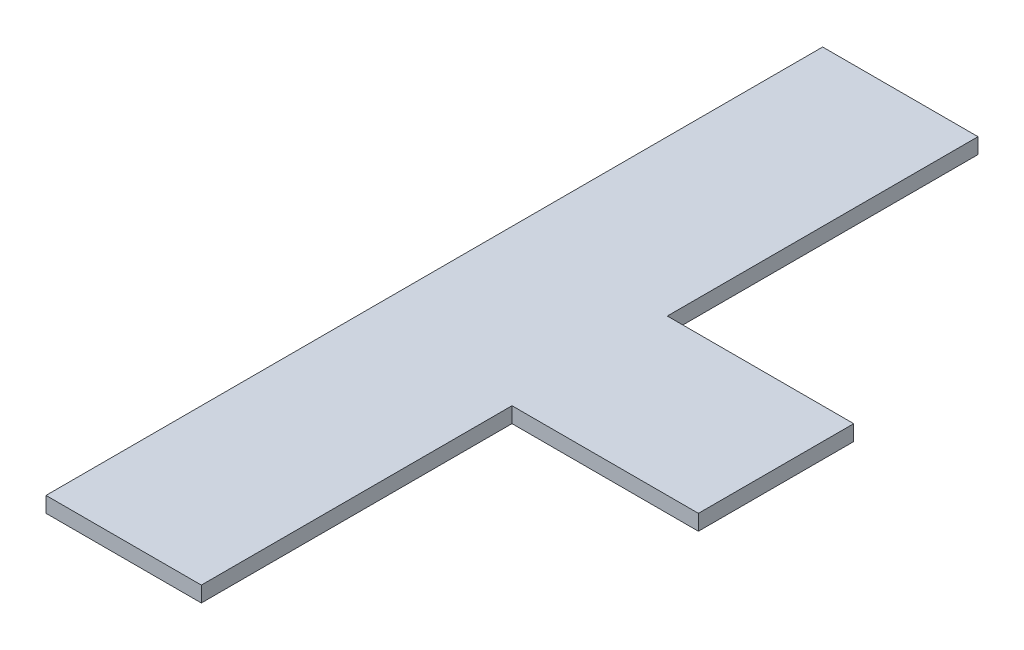
ISO-10303-21;
HEADER;
FILE_DESCRIPTION(('STEP AP214'),'2;1');
FILE_NAME('part.step','',(''),(''),'','','');
FILE_SCHEMA(('AUTOMOTIVE_DESIGN { 1 0 10303 214 1 1 1 1 }'));
ENDSEC;
DATA;
#1=APPLICATION_CONTEXT('core data for automotive mechanical design processes');
#2=APPLICATION_PROTOCOL_DEFINITION('international standard','automotive_design',2000,#1);
#3=PRODUCT_CONTEXT('',#1,'mechanical');
#4=PRODUCT('Part','Part','',(#3));
#5=PRODUCT_RELATED_PRODUCT_CATEGORY('part','',(#4));
#6=PRODUCT_DEFINITION_FORMATION('','',#4);
#7=PRODUCT_DEFINITION_CONTEXT('part definition',#1,'design');
#8=PRODUCT_DEFINITION('design','',#6,#7);
#9=PRODUCT_DEFINITION_SHAPE('','',#8);
#10=(LENGTH_UNIT() NAMED_UNIT(*) SI_UNIT(.MILLI.,.METRE.));
#11=(NAMED_UNIT(*) PLANE_ANGLE_UNIT() SI_UNIT($,.RADIAN.));
#12=(NAMED_UNIT(*) SI_UNIT($,.STERADIAN.) SOLID_ANGLE_UNIT());
#13=UNCERTAINTY_MEASURE_WITH_UNIT(LENGTH_MEASURE(1.E-05),#10,'distance_accuracy_value','');
#14=(GEOMETRIC_REPRESENTATION_CONTEXT(3) GLOBAL_UNCERTAINTY_ASSIGNED_CONTEXT((#13)) GLOBAL_UNIT_ASSIGNED_CONTEXT((#10,
#11,#12)) REPRESENTATION_CONTEXT('',''));
#15=CARTESIAN_POINT('',(0.,0.,0.));
#16=DIRECTION('',(0.,0.,1.));
#17=DIRECTION('',(1.,0.,0.));
#18=AXIS2_PLACEMENT_3D('',#15,#16,#17);
#19=CARTESIAN_POINT('',(0.,1.,0.));
#20=DIRECTION('',(1.,0.,0.));
#21=DIRECTION('',(0.,0.,-1.));
#22=AXIS2_PLACEMENT_3D('',#19,#20,#21);
#23=PLANE('',#22);
#24=DIRECTION('',(0.,0.,1.));
#25=VECTOR('',#24,1.);
#26=CARTESIAN_POINT('',(0.,0.,0.));
#27=LINE('',#26,#25);
#28=CARTESIAN_POINT('',(0.,0.,0.));
#29=VERTEX_POINT('',#28);
#30=CARTESIAN_POINT('',(0.,0.,50.));
#31=VERTEX_POINT('',#30);
#32=EDGE_CURVE('E168',#29,#31,#27,.T.);
#33=ORIENTED_EDGE('',*,*,#32,.T.);
#34=DIRECTION('',(0.,-1.,0.));
#35=VECTOR('',#34,1.);
#36=CARTESIAN_POINT('',(0.,1.,50.));
#37=LINE('',#36,#35);
#38=CARTESIAN_POINT('',(0.,1.,50.));
#39=VERTEX_POINT('',#38);
#40=EDGE_CURVE('E11',#39,#31,#37,.T.);
#41=ORIENTED_EDGE('',*,*,#40,.F.);
#42=DIRECTION('',(0.,0.,1.));
#43=VECTOR('',#42,1.);
#44=CARTESIAN_POINT('',(0.,1.,0.));
#45=LINE('',#44,#43);
#46=CARTESIAN_POINT('',(0.,1.,0.));
#47=VERTEX_POINT('',#46);
#48=EDGE_CURVE('E142',#47,#39,#45,.T.);
#49=ORIENTED_EDGE('',*,*,#48,.F.);
#50=DIRECTION('',(0.,-1.,0.));
#51=VECTOR('',#50,1.);
#52=CARTESIAN_POINT('',(0.,1.,0.));
#53=LINE('',#52,#51);
#54=EDGE_CURVE('E55',#47,#29,#53,.T.);
#55=ORIENTED_EDGE('',*,*,#54,.T.);
#56=EDGE_LOOP('',(#33,#41,#49,#55));
#57=FACE_BOUND('',#56,.T.);
#58=ADVANCED_FACE('F39',(#57),#23,.F.);
#59=CARTESIAN_POINT('',(0.,1.,50.));
#60=DIRECTION('',(0.,0.,-1.));
#61=DIRECTION('',(-1.,0.,0.));
#62=AXIS2_PLACEMENT_3D('',#59,#60,#61);
#63=PLANE('',#62);
#64=DIRECTION('',(1.,0.,0.));
#65=VECTOR('',#64,1.);
#66=CARTESIAN_POINT('',(0.,0.,50.));
#67=LINE('',#66,#65);
#68=CARTESIAN_POINT('',(10.,0.,50.));
#69=VERTEX_POINT('',#68);
#70=EDGE_CURVE('E166',#31,#69,#67,.T.);
#71=ORIENTED_EDGE('',*,*,#70,.T.);
#72=DIRECTION('',(0.,-1.,0.));
#73=VECTOR('',#72,1.);
#74=CARTESIAN_POINT('',(10.,1.,50.));
#75=LINE('',#74,#73);
#76=CARTESIAN_POINT('',(10.,1.,50.));
#77=VERTEX_POINT('',#76);
#78=EDGE_CURVE('E47',#77,#69,#75,.T.);
#79=ORIENTED_EDGE('',*,*,#78,.F.);
#80=DIRECTION('',(1.,0.,0.));
#81=VECTOR('',#80,1.);
#82=CARTESIAN_POINT('',(0.,1.,50.));
#83=LINE('',#82,#81);
#84=EDGE_CURVE('E93',#39,#77,#83,.T.);
#85=ORIENTED_EDGE('',*,*,#84,.F.);
#86=ORIENTED_EDGE('',*,*,#40,.T.);
#87=EDGE_LOOP('',(#71,#79,#85,#86));
#88=FACE_BOUND('',#87,.T.);
#89=ADVANCED_FACE('F167',(#88),#63,.F.);
#90=CARTESIAN_POINT('',(10.,1.,0.));
#91=DIRECTION('',(1.,0.,0.));
#92=DIRECTION('',(0.,0.,-1.));
#93=AXIS2_PLACEMENT_3D('',#90,#91,#92);
#94=PLANE('',#93);
#95=DIRECTION('',(0.,0.,1.));
#96=VECTOR('',#95,1.);
#97=CARTESIAN_POINT('',(10.,0.,0.));
#98=LINE('',#97,#96);
#99=CARTESIAN_POINT('',(10.,0.,30.));
#100=VERTEX_POINT('',#99);
#101=EDGE_CURVE('E151',#100,#69,#98,.T.);
#102=ORIENTED_EDGE('',*,*,#101,.F.);
#103=DIRECTION('',(0.,-1.,0.));
#104=VECTOR('',#103,1.);
#105=CARTESIAN_POINT('',(10.,1.,30.));
#106=LINE('',#105,#104);
#107=CARTESIAN_POINT('',(10.,1.,30.));
#108=VERTEX_POINT('',#107);
#109=EDGE_CURVE('E160',#108,#100,#106,.T.);
#110=ORIENTED_EDGE('',*,*,#109,.F.);
#111=DIRECTION('',(0.,0.,1.));
#112=VECTOR('',#111,1.);
#113=CARTESIAN_POINT('',(10.,1.,0.));
#114=LINE('',#113,#112);
#115=EDGE_CURVE('E133',#108,#77,#114,.T.);
#116=ORIENTED_EDGE('',*,*,#115,.T.);
#117=ORIENTED_EDGE('',*,*,#78,.T.);
#118=EDGE_LOOP('',(#102,#110,#116,#117));
#119=FACE_BOUND('',#118,.T.);
#120=ADVANCED_FACE('F163',(#119),#94,.T.);
#121=CARTESIAN_POINT('',(0.,1.,30.));
#122=DIRECTION('',(0.,0.,1.));
#123=DIRECTION('',(1.,0.,0.));
#124=AXIS2_PLACEMENT_3D('',#121,#122,#123);
#125=PLANE('',#124);
#126=DIRECTION('',(-1.,0.,0.));
#127=VECTOR('',#126,1.);
#128=CARTESIAN_POINT('',(0.,0.,30.));
#129=LINE('',#128,#127);
#130=CARTESIAN_POINT('',(22.,0.,30.));
#131=VERTEX_POINT('',#130);
#132=EDGE_CURVE('E173',#131,#100,#129,.T.);
#133=ORIENTED_EDGE('',*,*,#132,.F.);
#134=DIRECTION('',(0.,-1.,0.));
#135=VECTOR('',#134,1.);
#136=CARTESIAN_POINT('',(22.,1.,30.));
#137=LINE('',#136,#135);
#138=CARTESIAN_POINT('',(22.,1.,30.));
#139=VERTEX_POINT('',#138);
#140=EDGE_CURVE('E158',#139,#131,#137,.T.);
#141=ORIENTED_EDGE('',*,*,#140,.F.);
#142=DIRECTION('',(-1.,0.,0.));
#143=VECTOR('',#142,1.);
#144=CARTESIAN_POINT('',(0.,1.,30.));
#145=LINE('',#144,#143);
#146=EDGE_CURVE('E138',#139,#108,#145,.T.);
#147=ORIENTED_EDGE('',*,*,#146,.T.);
#148=ORIENTED_EDGE('',*,*,#109,.T.);
#149=EDGE_LOOP('',(#133,#141,#147,#148));
#150=FACE_BOUND('',#149,.T.);
#151=ADVANCED_FACE('F181',(#150),#125,.T.);
#152=CARTESIAN_POINT('',(22.,1.,0.));
#153=DIRECTION('',(1.,0.,0.));
#154=DIRECTION('',(0.,0.,-1.));
#155=AXIS2_PLACEMENT_3D('',#152,#153,#154);
#156=PLANE('',#155);
#157=DIRECTION('',(0.,0.,1.));
#158=VECTOR('',#157,1.);
#159=CARTESIAN_POINT('',(22.,0.,0.));
#160=LINE('',#159,#158);
#161=CARTESIAN_POINT('',(22.,0.,20.));
#162=VERTEX_POINT('',#161);
#163=EDGE_CURVE('E174',#162,#131,#160,.T.);
#164=ORIENTED_EDGE('',*,*,#163,.F.);
#165=DIRECTION('',(0.,-1.,0.));
#166=VECTOR('',#165,1.);
#167=CARTESIAN_POINT('',(22.,1.,20.));
#168=LINE('',#167,#166);
#169=CARTESIAN_POINT('',(22.,1.,20.));
#170=VERTEX_POINT('',#169);
#171=EDGE_CURVE('E118',#170,#162,#168,.T.);
#172=ORIENTED_EDGE('',*,*,#171,.F.);
#173=DIRECTION('',(0.,0.,1.));
#174=VECTOR('',#173,1.);
#175=CARTESIAN_POINT('',(22.,1.,0.));
#176=LINE('',#175,#174);
#177=EDGE_CURVE('E128',#170,#139,#176,.T.);
#178=ORIENTED_EDGE('',*,*,#177,.T.);
#179=ORIENTED_EDGE('',*,*,#140,.T.);
#180=EDGE_LOOP('',(#164,#172,#178,#179));
#181=FACE_BOUND('',#180,.T.);
#182=ADVANCED_FACE('F179',(#181),#156,.T.);
#183=CARTESIAN_POINT('',(0.,1.,20.));
#184=DIRECTION('',(0.,0.,-1.));
#185=DIRECTION('',(-1.,0.,0.));
#186=AXIS2_PLACEMENT_3D('',#183,#184,#185);
#187=PLANE('',#186);
#188=DIRECTION('',(1.,0.,0.));
#189=VECTOR('',#188,1.);
#190=CARTESIAN_POINT('',(0.,0.,20.));
#191=LINE('',#190,#189);
#192=CARTESIAN_POINT('',(10.,0.,20.));
#193=VERTEX_POINT('',#192);
#194=EDGE_CURVE('E114',#193,#162,#191,.T.);
#195=ORIENTED_EDGE('',*,*,#194,.F.);
#196=DIRECTION('',(0.,-1.,0.));
#197=VECTOR('',#196,1.);
#198=CARTESIAN_POINT('',(10.,1.,20.));
#199=LINE('',#198,#197);
#200=CARTESIAN_POINT('',(10.,1.,20.));
#201=VERTEX_POINT('',#200);
#202=EDGE_CURVE('E109',#201,#193,#199,.T.);
#203=ORIENTED_EDGE('',*,*,#202,.F.);
#204=DIRECTION('',(1.,0.,0.));
#205=VECTOR('',#204,1.);
#206=CARTESIAN_POINT('',(0.,1.,20.));
#207=LINE('',#206,#205);
#208=EDGE_CURVE('E112',#201,#170,#207,.T.);
#209=ORIENTED_EDGE('',*,*,#208,.T.);
#210=ORIENTED_EDGE('',*,*,#171,.T.);
#211=EDGE_LOOP('',(#195,#203,#209,#210));
#212=FACE_BOUND('',#211,.T.);
#213=ADVANCED_FACE('F111',(#212),#187,.T.);
#214=CARTESIAN_POINT('',(10.,0.,0.));
#215=VERTEX_POINT('',#214);
#216=EDGE_CURVE('E147',#215,#193,#98,.T.);
#217=ORIENTED_EDGE('',*,*,#216,.F.);
#218=DIRECTION('',(0.,-1.,0.));
#219=VECTOR('',#218,1.);
#220=CARTESIAN_POINT('',(10.,1.,0.));
#221=LINE('',#220,#219);
#222=CARTESIAN_POINT('',(10.,1.,0.));
#223=VERTEX_POINT('',#222);
#224=EDGE_CURVE('E81',#223,#215,#221,.T.);
#225=ORIENTED_EDGE('',*,*,#224,.F.);
#226=EDGE_CURVE('E125',#223,#201,#114,.T.);
#227=ORIENTED_EDGE('',*,*,#226,.T.);
#228=ORIENTED_EDGE('',*,*,#202,.T.);
#229=EDGE_LOOP('',(#217,#225,#227,#228));
#230=FACE_BOUND('',#229,.T.);
#231=ADVANCED_FACE('F130',(#230),#94,.T.);
#232=CARTESIAN_POINT('',(0.,1.,0.));
#233=DIRECTION('',(0.,0.,-1.));
#234=DIRECTION('',(-1.,0.,0.));
#235=AXIS2_PLACEMENT_3D('',#232,#233,#234);
#236=PLANE('',#235);
#237=DIRECTION('',(1.,0.,0.));
#238=VECTOR('',#237,1.);
#239=CARTESIAN_POINT('',(0.,0.,0.));
#240=LINE('',#239,#238);
#241=EDGE_CURVE('E143',#29,#215,#240,.T.);
#242=ORIENTED_EDGE('',*,*,#241,.F.);
#243=ORIENTED_EDGE('',*,*,#54,.F.);
#244=DIRECTION('',(1.,0.,0.));
#245=VECTOR('',#244,1.);
#246=CARTESIAN_POINT('',(0.,1.,0.));
#247=LINE('',#246,#245);
#248=EDGE_CURVE('E131',#47,#223,#247,.T.);
#249=ORIENTED_EDGE('',*,*,#248,.T.);
#250=ORIENTED_EDGE('',*,*,#224,.T.);
#251=EDGE_LOOP('',(#242,#243,#249,#250));
#252=FACE_BOUND('',#251,.T.);
#253=ADVANCED_FACE('F195',(#252),#236,.T.);
#254=CARTESIAN_POINT('',(0.,1.,0.));
#255=DIRECTION('',(0.,1.,0.));
#256=DIRECTION('',(0.,0.,1.));
#257=AXIS2_PLACEMENT_3D('',#254,#255,#256);
#258=PLANE('',#257);
#259=ORIENTED_EDGE('',*,*,#48,.T.);
#260=ORIENTED_EDGE('',*,*,#84,.T.);
#261=ORIENTED_EDGE('',*,*,#115,.F.);
#262=ORIENTED_EDGE('',*,*,#146,.F.);
#263=ORIENTED_EDGE('',*,*,#177,.F.);
#264=ORIENTED_EDGE('',*,*,#208,.F.);
#265=ORIENTED_EDGE('',*,*,#226,.F.);
#266=ORIENTED_EDGE('',*,*,#248,.F.);
#267=EDGE_LOOP('',(#259,#260,#261,#262,#263,#264,#265,#266));
#268=FACE_BOUND('',#267,.T.);
#269=ADVANCED_FACE('F123',(#268),#258,.T.);
#270=CARTESIAN_POINT('',(0.,0.,0.));
#271=DIRECTION('',(0.,1.,0.));
#272=DIRECTION('',(0.,0.,1.));
#273=AXIS2_PLACEMENT_3D('',#270,#271,#272);
#274=PLANE('',#273);
#275=ORIENTED_EDGE('',*,*,#32,.F.);
#276=ORIENTED_EDGE('',*,*,#241,.T.);
#277=ORIENTED_EDGE('',*,*,#216,.T.);
#278=ORIENTED_EDGE('',*,*,#194,.T.);
#279=ORIENTED_EDGE('',*,*,#163,.T.);
#280=ORIENTED_EDGE('',*,*,#132,.T.);
#281=ORIENTED_EDGE('',*,*,#101,.T.);
#282=ORIENTED_EDGE('',*,*,#70,.F.);
#283=EDGE_LOOP('',(#275,#276,#277,#278,#279,#280,#281,#282));
#284=FACE_BOUND('',#283,.T.);
#285=ADVANCED_FACE('F170',(#284),#274,.F.);
#286=CLOSED_SHELL('',(#58,#89,#120,#151,#182,#213,#231,#253,#269,#285));
#287=MANIFOLD_SOLID_BREP('B2',#286);
#288=ADVANCED_BREP_SHAPE_REPRESENTATION('',(#18,#287),#14);
#289=SHAPE_DEFINITION_REPRESENTATION(#9,#288);
ENDSEC;
END-ISO-10303-21;
